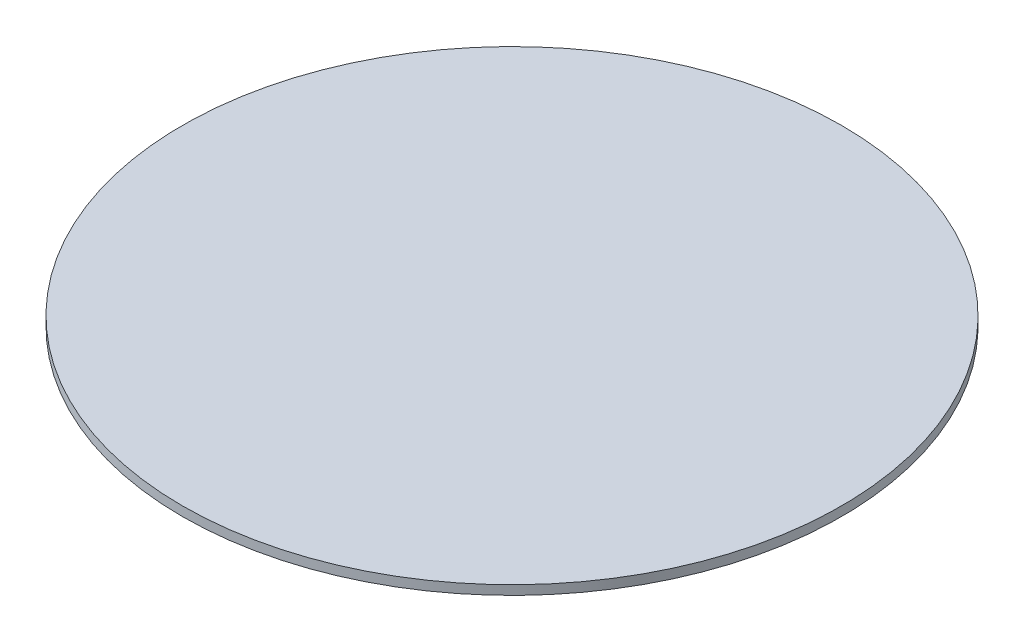
ISO-10303-21;
HEADER;
FILE_DESCRIPTION(('STEP AP214'),'2;1');
FILE_NAME('part.step','',(''),(''),'','','');
FILE_SCHEMA(('AUTOMOTIVE_DESIGN { 1 0 10303 214 1 1 1 1 }'));
ENDSEC;
DATA;
#1=APPLICATION_CONTEXT('core data for automotive mechanical design processes');
#2=APPLICATION_PROTOCOL_DEFINITION('international standard','automotive_design',2000,#1);
#3=PRODUCT_CONTEXT('',#1,'mechanical');
#4=PRODUCT('Part','Part','',(#3));
#5=PRODUCT_RELATED_PRODUCT_CATEGORY('part','',(#4));
#6=PRODUCT_DEFINITION_FORMATION('','',#4);
#7=PRODUCT_DEFINITION_CONTEXT('part definition',#1,'design');
#8=PRODUCT_DEFINITION('design','',#6,#7);
#9=PRODUCT_DEFINITION_SHAPE('','',#8);
#10=(LENGTH_UNIT() NAMED_UNIT(*) SI_UNIT(.MILLI.,.METRE.));
#11=(NAMED_UNIT(*) PLANE_ANGLE_UNIT() SI_UNIT($,.RADIAN.));
#12=(NAMED_UNIT(*) SI_UNIT($,.STERADIAN.) SOLID_ANGLE_UNIT());
#13=UNCERTAINTY_MEASURE_WITH_UNIT(LENGTH_MEASURE(1.E-05),#10,'distance_accuracy_value','');
#14=(GEOMETRIC_REPRESENTATION_CONTEXT(3) GLOBAL_UNCERTAINTY_ASSIGNED_CONTEXT((#13)) GLOBAL_UNIT_ASSIGNED_CONTEXT((#10,
#11,#12)) REPRESENTATION_CONTEXT('',''));
#15=CARTESIAN_POINT('',(0.,0.,0.));
#16=DIRECTION('',(0.,0.,1.));
#17=DIRECTION('',(1.,0.,0.));
#18=AXIS2_PLACEMENT_3D('',#15,#16,#17);
#19=CARTESIAN_POINT('',(0.,2.,0.));
#20=DIRECTION('',(0.,-1.,0.));
#21=DIRECTION('',(0.,0.,-1.));
#22=AXIS2_PLACEMENT_3D('',#19,#20,#21);
#23=CYLINDRICAL_SURFACE('',#22,71.);
#24=CARTESIAN_POINT('',(0.,2.,0.));
#25=DIRECTION('',(0.,1.,0.));
#26=DIRECTION('',(0.,0.,1.));
#27=AXIS2_PLACEMENT_3D('',#24,#25,#26);
#28=CIRCLE('',#27,71.);
#29=CARTESIAN_POINT('',(0.,2.,71.));
#30=VERTEX_POINT('',#29);
#31=EDGE_CURVE('E10',#30,#30,#28,.T.);
#32=ORIENTED_EDGE('',*,*,#31,.F.);
#33=EDGE_LOOP('',(#32));
#34=FACE_BOUND('',#33,.T.);
#35=CARTESIAN_POINT('',(0.,0.,0.));
#36=DIRECTION('',(0.,1.,0.));
#37=DIRECTION('',(0.,0.,1.));
#38=AXIS2_PLACEMENT_3D('',#35,#36,#37);
#39=CIRCLE('',#38,71.);
#40=CARTESIAN_POINT('',(0.,0.,71.));
#41=VERTEX_POINT('',#40);
#42=EDGE_CURVE('E33',#41,#41,#39,.T.);
#43=ORIENTED_EDGE('',*,*,#42,.T.);
#44=EDGE_LOOP('',(#43));
#45=FACE_BOUND('',#44,.T.);
#46=ADVANCED_FACE('F30',(#34,#45),#23,.T.);
#47=CARTESIAN_POINT('',(0.,2.,0.));
#48=DIRECTION('',(0.,1.,0.));
#49=DIRECTION('',(0.,0.,1.));
#50=AXIS2_PLACEMENT_3D('',#47,#48,#49);
#51=PLANE('',#50);
#52=ORIENTED_EDGE('',*,*,#31,.T.);
#53=EDGE_LOOP('',(#52));
#54=FACE_BOUND('',#53,.T.);
#55=ADVANCED_FACE('F45',(#54),#51,.T.);
#56=CARTESIAN_POINT('',(0.,0.,0.));
#57=DIRECTION('',(0.,1.,0.));
#58=DIRECTION('',(0.,0.,1.));
#59=AXIS2_PLACEMENT_3D('',#56,#57,#58);
#60=PLANE('',#59);
#61=ORIENTED_EDGE('',*,*,#42,.F.);
#62=EDGE_LOOP('',(#61));
#63=FACE_BOUND('',#62,.T.);
#64=ADVANCED_FACE('F43',(#63),#60,.F.);
#65=CLOSED_SHELL('',(#46,#55,#64));
#66=MANIFOLD_SOLID_BREP('B2',#65);
#67=ADVANCED_BREP_SHAPE_REPRESENTATION('',(#18,#66),#14);
#68=SHAPE_DEFINITION_REPRESENTATION(#9,#67);
ENDSEC;
END-ISO-10303-21;
